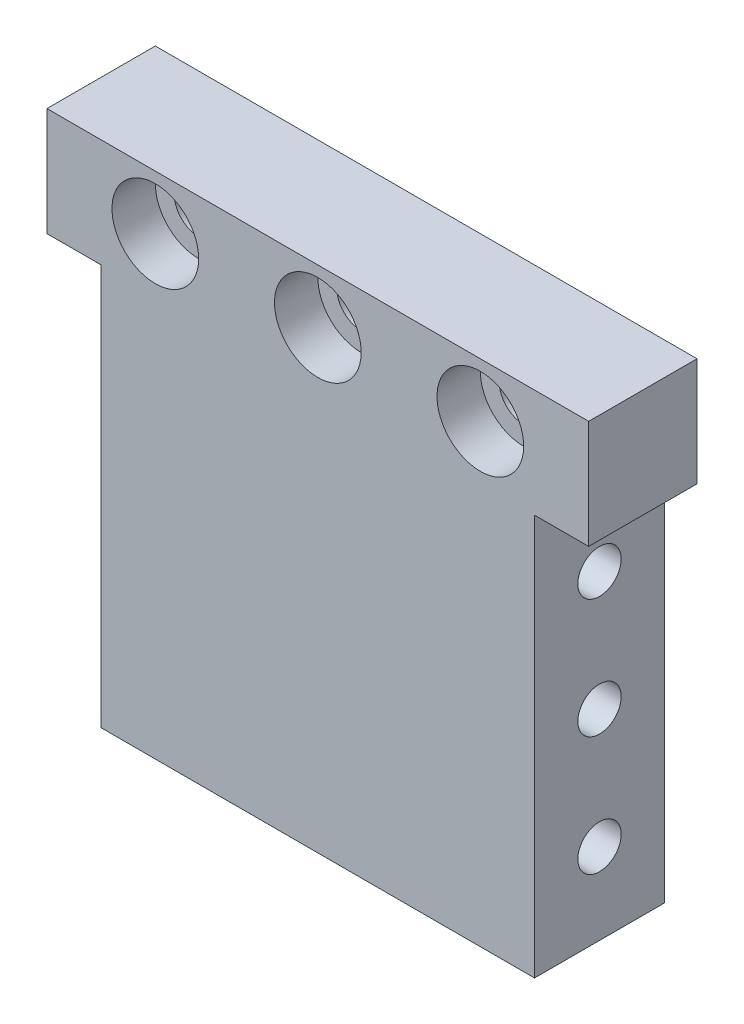
ISO-10303-21;
HEADER;
FILE_DESCRIPTION(('STEP AP214'),'2;1');
FILE_NAME('part.step','',(''),(''),'','','');
FILE_SCHEMA(('AUTOMOTIVE_DESIGN { 1 0 10303 214 1 1 1 1 }'));
ENDSEC;
DATA;
#1=APPLICATION_CONTEXT('core data for automotive mechanical design processes');
#2=APPLICATION_PROTOCOL_DEFINITION('international standard','automotive_design',2000,#1);
#3=PRODUCT_CONTEXT('',#1,'mechanical');
#4=PRODUCT('Part','Part','',(#3));
#5=PRODUCT_RELATED_PRODUCT_CATEGORY('part','',(#4));
#6=PRODUCT_DEFINITION_FORMATION('','',#4);
#7=PRODUCT_DEFINITION_CONTEXT('part definition',#1,'design');
#8=PRODUCT_DEFINITION('design','',#6,#7);
#9=PRODUCT_DEFINITION_SHAPE('','',#8);
#10=(LENGTH_UNIT() NAMED_UNIT(*) SI_UNIT(.MILLI.,.METRE.));
#11=(NAMED_UNIT(*) PLANE_ANGLE_UNIT() SI_UNIT($,.RADIAN.));
#12=(NAMED_UNIT(*) SI_UNIT($,.STERADIAN.) SOLID_ANGLE_UNIT());
#13=UNCERTAINTY_MEASURE_WITH_UNIT(LENGTH_MEASURE(1.E-05),#10,'distance_accuracy_value','');
#14=(GEOMETRIC_REPRESENTATION_CONTEXT(3) GLOBAL_UNCERTAINTY_ASSIGNED_CONTEXT((#13)) GLOBAL_UNIT_ASSIGNED_CONTEXT((#10,
#11,#12)) REPRESENTATION_CONTEXT('',''));
#15=CARTESIAN_POINT('',(0.,0.,0.));
#16=DIRECTION('',(0.,0.,1.));
#17=DIRECTION('',(1.,0.,0.));
#18=AXIS2_PLACEMENT_3D('',#15,#16,#17);
#19=CARTESIAN_POINT('',(40.,42.,0.));
#20=DIRECTION('',(0.,0.,1.));
#21=DIRECTION('',(1.,0.,0.));
#22=AXIS2_PLACEMENT_3D('',#19,#20,#21);
#23=CYLINDRICAL_SURFACE('',#22,2.25);
#24=CARTESIAN_POINT('',(40.,42.,2.));
#25=DIRECTION('',(0.,0.,1.));
#26=DIRECTION('',(1.,0.,0.));
#27=AXIS2_PLACEMENT_3D('',#24,#25,#26);
#28=CIRCLE('',#27,2.25);
#29=CARTESIAN_POINT('',(42.25,42.,2.));
#30=VERTEX_POINT('',#29);
#31=EDGE_CURVE('E136',#30,#30,#28,.T.);
#32=ORIENTED_EDGE('',*,*,#31,.F.);
#33=EDGE_LOOP('',(#32));
#34=FACE_BOUND('',#33,.T.);
#35=CARTESIAN_POINT('',(40.,42.,8.));
#36=DIRECTION('',(0.,0.,1.));
#37=DIRECTION('',(1.,0.,0.));
#38=AXIS2_PLACEMENT_3D('',#35,#36,#37);
#39=CIRCLE('',#38,2.25);
#40=CARTESIAN_POINT('',(42.25,42.,8.));
#41=VERTEX_POINT('',#40);
#42=EDGE_CURVE('E38',#41,#41,#39,.F.);
#43=ORIENTED_EDGE('',*,*,#42,.F.);
#44=EDGE_LOOP('',(#43));
#45=FACE_BOUND('',#44,.T.);
#46=ADVANCED_FACE('F34',(#34,#45),#23,.F.);
#47=CARTESIAN_POINT('',(25.,42.,0.));
#48=DIRECTION('',(0.,0.,1.));
#49=DIRECTION('',(1.,0.,0.));
#50=AXIS2_PLACEMENT_3D('',#47,#48,#49);
#51=CYLINDRICAL_SURFACE('',#50,2.25);
#52=CARTESIAN_POINT('',(25.,42.,2.));
#53=DIRECTION('',(0.,0.,1.));
#54=DIRECTION('',(1.,0.,0.));
#55=AXIS2_PLACEMENT_3D('',#52,#53,#54);
#56=CIRCLE('',#55,2.25);
#57=CARTESIAN_POINT('',(27.25,42.,2.));
#58=VERTEX_POINT('',#57);
#59=EDGE_CURVE('E131',#58,#58,#56,.T.);
#60=ORIENTED_EDGE('',*,*,#59,.F.);
#61=EDGE_LOOP('',(#60));
#62=FACE_BOUND('',#61,.T.);
#63=CARTESIAN_POINT('',(25.,42.,8.));
#64=DIRECTION('',(0.,0.,1.));
#65=DIRECTION('',(1.,0.,0.));
#66=AXIS2_PLACEMENT_3D('',#63,#64,#65);
#67=CIRCLE('',#66,2.25);
#68=CARTESIAN_POINT('',(27.25,42.,8.));
#69=VERTEX_POINT('',#68);
#70=EDGE_CURVE('E164',#69,#69,#67,.F.);
#71=ORIENTED_EDGE('',*,*,#70,.F.);
#72=EDGE_LOOP('',(#71));
#73=FACE_BOUND('',#72,.T.);
#74=ADVANCED_FACE('F285',(#62,#73),#51,.F.);
#75=CARTESIAN_POINT('',(10.,42.,0.));
#76=DIRECTION('',(0.,0.,1.));
#77=DIRECTION('',(1.,0.,0.));
#78=AXIS2_PLACEMENT_3D('',#75,#76,#77);
#79=CYLINDRICAL_SURFACE('',#78,2.25);
#80=CARTESIAN_POINT('',(10.,42.,2.));
#81=DIRECTION('',(0.,0.,1.));
#82=DIRECTION('',(1.,0.,0.));
#83=AXIS2_PLACEMENT_3D('',#80,#81,#82);
#84=CIRCLE('',#83,2.25);
#85=CARTESIAN_POINT('',(12.25,42.,2.));
#86=VERTEX_POINT('',#85);
#87=EDGE_CURVE('E156',#86,#86,#84,.T.);
#88=ORIENTED_EDGE('',*,*,#87,.F.);
#89=EDGE_LOOP('',(#88));
#90=FACE_BOUND('',#89,.T.);
#91=CARTESIAN_POINT('',(10.,42.,8.));
#92=DIRECTION('',(0.,0.,1.));
#93=DIRECTION('',(1.,0.,0.));
#94=AXIS2_PLACEMENT_3D('',#91,#92,#93);
#95=CIRCLE('',#94,2.25);
#96=CARTESIAN_POINT('',(12.25,42.,8.));
#97=VERTEX_POINT('',#96);
#98=EDGE_CURVE('E160',#97,#97,#95,.F.);
#99=ORIENTED_EDGE('',*,*,#98,.F.);
#100=EDGE_LOOP('',(#99));
#101=FACE_BOUND('',#100,.T.);
#102=ADVANCED_FACE('F291',(#90,#101),#79,.F.);
#103=CARTESIAN_POINT('',(0.,0.,12.));
#104=DIRECTION('',(1.,0.,0.));
#105=DIRECTION('',(0.,0.,-1.));
#106=AXIS2_PLACEMENT_3D('',#103,#104,#105);
#107=PLANE('',#106);
#108=DIRECTION('',(0.,1.,0.));
#109=VECTOR('',#108,1.);
#110=CARTESIAN_POINT('',(0.,47.,2.));
#111=LINE('',#110,#109);
#112=CARTESIAN_POINT('',(0.,37.,2.));
#113=VERTEX_POINT('',#112);
#114=CARTESIAN_POINT('',(0.,47.,2.));
#115=VERTEX_POINT('',#114);
#116=EDGE_CURVE('E130',#113,#115,#111,.T.);
#117=ORIENTED_EDGE('',*,*,#116,.F.);
#118=DIRECTION('',(0.,0.,1.));
#119=VECTOR('',#118,1.);
#120=CARTESIAN_POINT('',(0.,37.,0.));
#121=LINE('',#120,#119);
#122=CARTESIAN_POINT('',(0.,37.,12.));
#123=VERTEX_POINT('',#122);
#124=EDGE_CURVE('E159',#113,#123,#121,.T.);
#125=ORIENTED_EDGE('',*,*,#124,.T.);
#126=DIRECTION('',(0.,-1.,0.));
#127=VECTOR('',#126,1.);
#128=CARTESIAN_POINT('',(0.,0.,12.));
#129=LINE('',#128,#127);
#130=CARTESIAN_POINT('',(0.,47.,12.));
#131=VERTEX_POINT('',#130);
#132=EDGE_CURVE('E142',#131,#123,#129,.T.);
#133=ORIENTED_EDGE('',*,*,#132,.F.);
#134=DIRECTION('',(0.,0.,-1.));
#135=VECTOR('',#134,1.);
#136=CARTESIAN_POINT('',(0.,47.,12.));
#137=LINE('',#136,#135);
#138=EDGE_CURVE('E43',#131,#115,#137,.T.);
#139=ORIENTED_EDGE('',*,*,#138,.T.);
#140=EDGE_LOOP('',(#117,#125,#133,#139));
#141=FACE_BOUND('',#140,.T.);
#142=ADVANCED_FACE('F36',(#141),#107,.F.);
#143=CARTESIAN_POINT('',(0.,0.,12.));
#144=DIRECTION('',(0.,1.,0.));
#145=DIRECTION('',(0.,0.,1.));
#146=AXIS2_PLACEMENT_3D('',#143,#144,#145);
#147=PLANE('',#146);
#148=DIRECTION('',(1.,0.,0.));
#149=VECTOR('',#148,1.);
#150=CARTESIAN_POINT('',(0.,0.,0.));
#151=LINE('',#150,#149);
#152=CARTESIAN_POINT('',(5.,0.,0.));
#153=VERTEX_POINT('',#152);
#154=CARTESIAN_POINT('',(45.,0.,0.));
#155=VERTEX_POINT('',#154);
#156=EDGE_CURVE('E145',#153,#155,#151,.T.);
#157=ORIENTED_EDGE('',*,*,#156,.T.);
#158=DIRECTION('',(0.,0.,1.));
#159=VECTOR('',#158,1.);
#160=CARTESIAN_POINT('',(45.,0.,0.));
#161=LINE('',#160,#159);
#162=CARTESIAN_POINT('',(45.,0.,12.));
#163=VERTEX_POINT('',#162);
#164=EDGE_CURVE('E109',#155,#163,#161,.T.);
#165=ORIENTED_EDGE('',*,*,#164,.T.);
#166=DIRECTION('',(1.,0.,0.));
#167=VECTOR('',#166,1.);
#168=CARTESIAN_POINT('',(0.,0.,12.));
#169=LINE('',#168,#167);
#170=CARTESIAN_POINT('',(5.,0.,12.));
#171=VERTEX_POINT('',#170);
#172=EDGE_CURVE('E144',#171,#163,#169,.T.);
#173=ORIENTED_EDGE('',*,*,#172,.F.);
#174=DIRECTION('',(0.,0.,1.));
#175=VECTOR('',#174,1.);
#176=CARTESIAN_POINT('',(5.,0.,0.));
#177=LINE('',#176,#175);
#178=EDGE_CURVE('E228',#153,#171,#177,.T.);
#179=ORIENTED_EDGE('',*,*,#178,.F.);
#180=EDGE_LOOP('',(#157,#165,#173,#179));
#181=FACE_BOUND('',#180,.T.);
#182=ADVANCED_FACE('F261',(#181),#147,.F.);
#183=CARTESIAN_POINT('',(50.,0.,12.));
#184=DIRECTION('',(-1.,0.,0.));
#185=DIRECTION('',(0.,0.,1.));
#186=AXIS2_PLACEMENT_3D('',#183,#184,#185);
#187=PLANE('',#186);
#188=DIRECTION('',(0.,1.,0.));
#189=VECTOR('',#188,1.);
#190=CARTESIAN_POINT('',(50.,0.,12.));
#191=LINE('',#190,#189);
#192=CARTESIAN_POINT('',(50.,37.,12.));
#193=VERTEX_POINT('',#192);
#194=CARTESIAN_POINT('',(50.,47.,12.));
#195=VERTEX_POINT('',#194);
#196=EDGE_CURVE('E148',#193,#195,#191,.T.);
#197=ORIENTED_EDGE('',*,*,#196,.F.);
#198=DIRECTION('',(0.,0.,1.));
#199=VECTOR('',#198,1.);
#200=CARTESIAN_POINT('',(50.,37.,0.));
#201=LINE('',#200,#199);
#202=CARTESIAN_POINT('',(50.,37.,2.));
#203=VERTEX_POINT('',#202);
#204=EDGE_CURVE('E114',#203,#193,#201,.T.);
#205=ORIENTED_EDGE('',*,*,#204,.F.);
#206=DIRECTION('',(0.,-1.,0.));
#207=VECTOR('',#206,1.);
#208=CARTESIAN_POINT('',(50.,47.,2.));
#209=LINE('',#208,#207);
#210=CARTESIAN_POINT('',(50.,47.,2.));
#211=VERTEX_POINT('',#210);
#212=EDGE_CURVE('E239',#211,#203,#209,.T.);
#213=ORIENTED_EDGE('',*,*,#212,.F.);
#214=DIRECTION('',(0.,0.,-1.));
#215=VECTOR('',#214,1.);
#216=CARTESIAN_POINT('',(50.,47.,12.));
#217=LINE('',#216,#215);
#218=EDGE_CURVE('E11',#195,#211,#217,.T.);
#219=ORIENTED_EDGE('',*,*,#218,.F.);
#220=EDGE_LOOP('',(#197,#205,#213,#219));
#221=FACE_BOUND('',#220,.T.);
#222=ADVANCED_FACE('F254',(#221),#187,.F.);
#223=CARTESIAN_POINT('',(0.,47.,12.));
#224=DIRECTION('',(0.,-1.,0.));
#225=DIRECTION('',(0.,0.,-1.));
#226=AXIS2_PLACEMENT_3D('',#223,#224,#225);
#227=PLANE('',#226);
#228=ORIENTED_EDGE('',*,*,#218,.T.);
#229=DIRECTION('',(1.,0.,0.));
#230=VECTOR('',#229,1.);
#231=CARTESIAN_POINT('',(0.,47.,2.));
#232=LINE('',#231,#230);
#233=EDGE_CURVE('E133',#115,#211,#232,.T.);
#234=ORIENTED_EDGE('',*,*,#233,.F.);
#235=ORIENTED_EDGE('',*,*,#138,.F.);
#236=DIRECTION('',(-1.,0.,0.));
#237=VECTOR('',#236,1.);
#238=CARTESIAN_POINT('',(0.,47.,12.));
#239=LINE('',#238,#237);
#240=EDGE_CURVE('E59',#195,#131,#239,.T.);
#241=ORIENTED_EDGE('',*,*,#240,.F.);
#242=EDGE_LOOP('',(#228,#234,#235,#241));
#243=FACE_BOUND('',#242,.T.);
#244=ADVANCED_FACE('F273',(#243),#227,.F.);
#245=CARTESIAN_POINT('',(0.,0.,12.));
#246=DIRECTION('',(0.,0.,-1.));
#247=DIRECTION('',(-1.,0.,0.));
#248=AXIS2_PLACEMENT_3D('',#245,#246,#247);
#249=PLANE('',#248);
#250=CARTESIAN_POINT('',(40.,42.,12.));
#251=DIRECTION('',(0.,0.,1.));
#252=DIRECTION('',(1.,0.,0.));
#253=AXIS2_PLACEMENT_3D('',#250,#251,#252);
#254=CIRCLE('',#253,4.);
#255=CARTESIAN_POINT('',(44.,42.,12.));
#256=VERTEX_POINT('',#255);
#257=EDGE_CURVE('E180',#256,#256,#254,.T.);
#258=ORIENTED_EDGE('',*,*,#257,.F.);
#259=EDGE_LOOP('',(#258));
#260=FACE_BOUND('',#259,.T.);
#261=CARTESIAN_POINT('',(25.,42.,12.));
#262=DIRECTION('',(0.,0.,1.));
#263=DIRECTION('',(1.,0.,0.));
#264=AXIS2_PLACEMENT_3D('',#261,#262,#263);
#265=CIRCLE('',#264,4.);
#266=CARTESIAN_POINT('',(29.,42.,12.));
#267=VERTEX_POINT('',#266);
#268=EDGE_CURVE('E173',#267,#267,#265,.T.);
#269=ORIENTED_EDGE('',*,*,#268,.F.);
#270=EDGE_LOOP('',(#269));
#271=FACE_BOUND('',#270,.T.);
#272=CARTESIAN_POINT('',(10.,42.,12.));
#273=DIRECTION('',(0.,0.,1.));
#274=DIRECTION('',(1.,0.,0.));
#275=AXIS2_PLACEMENT_3D('',#272,#273,#274);
#276=CIRCLE('',#275,4.);
#277=CARTESIAN_POINT('',(14.,42.,12.));
#278=VERTEX_POINT('',#277);
#279=EDGE_CURVE('E166',#278,#278,#276,.T.);
#280=ORIENTED_EDGE('',*,*,#279,.F.);
#281=EDGE_LOOP('',(#280));
#282=FACE_BOUND('',#281,.T.);
#283=ORIENTED_EDGE('',*,*,#172,.T.);
#284=DIRECTION('',(0.,-1.,0.));
#285=VECTOR('',#284,1.);
#286=CARTESIAN_POINT('',(45.,0.,12.));
#287=LINE('',#286,#285);
#288=CARTESIAN_POINT('',(45.,37.,12.));
#289=VERTEX_POINT('',#288);
#290=EDGE_CURVE('E115',#289,#163,#287,.T.);
#291=ORIENTED_EDGE('',*,*,#290,.F.);
#292=DIRECTION('',(-1.,0.,0.));
#293=VECTOR('',#292,1.);
#294=CARTESIAN_POINT('',(50.,37.,12.));
#295=LINE('',#294,#293);
#296=EDGE_CURVE('E218',#193,#289,#295,.T.);
#297=ORIENTED_EDGE('',*,*,#296,.F.);
#298=ORIENTED_EDGE('',*,*,#196,.T.);
#299=ORIENTED_EDGE('',*,*,#240,.T.);
#300=ORIENTED_EDGE('',*,*,#132,.T.);
#301=DIRECTION('',(-1.,0.,0.));
#302=VECTOR('',#301,1.);
#303=CARTESIAN_POINT('',(0.,37.,12.));
#304=LINE('',#303,#302);
#305=CARTESIAN_POINT('',(5.,37.,12.));
#306=VERTEX_POINT('',#305);
#307=EDGE_CURVE('E229',#306,#123,#304,.T.);
#308=ORIENTED_EDGE('',*,*,#307,.F.);
#309=DIRECTION('',(0.,1.,0.));
#310=VECTOR('',#309,1.);
#311=CARTESIAN_POINT('',(5.,0.,12.));
#312=LINE('',#311,#310);
#313=EDGE_CURVE('E224',#171,#306,#312,.T.);
#314=ORIENTED_EDGE('',*,*,#313,.F.);
#315=EDGE_LOOP('',(#283,#291,#297,#298,#299,#300,#308,#314));
#316=FACE_BOUND('',#315,.T.);
#317=ADVANCED_FACE('F256',(#260,#271,#282,#316),#249,.F.);
#318=CARTESIAN_POINT('',(0.,0.,0.));
#319=DIRECTION('',(0.,0.,-1.));
#320=DIRECTION('',(-1.,0.,0.));
#321=AXIS2_PLACEMENT_3D('',#318,#319,#320);
#322=PLANE('',#321);
#323=DIRECTION('',(0.,-1.,0.));
#324=VECTOR('',#323,1.);
#325=CARTESIAN_POINT('',(45.,0.,0.));
#326=LINE('',#325,#324);
#327=CARTESIAN_POINT('',(45.,37.,0.));
#328=VERTEX_POINT('',#327);
#329=EDGE_CURVE('E106',#328,#155,#326,.T.);
#330=ORIENTED_EDGE('',*,*,#329,.T.);
#331=ORIENTED_EDGE('',*,*,#156,.F.);
#332=DIRECTION('',(0.,1.,0.));
#333=VECTOR('',#332,1.);
#334=CARTESIAN_POINT('',(5.,0.,0.));
#335=LINE('',#334,#333);
#336=CARTESIAN_POINT('',(5.,37.,0.));
#337=VERTEX_POINT('',#336);
#338=EDGE_CURVE('E129',#153,#337,#335,.T.);
#339=ORIENTED_EDGE('',*,*,#338,.T.);
#340=DIRECTION('',(-1.,0.,0.));
#341=VECTOR('',#340,1.);
#342=CARTESIAN_POINT('',(0.,37.,0.));
#343=LINE('',#342,#341);
#344=EDGE_CURVE('E121',#328,#337,#343,.T.);
#345=ORIENTED_EDGE('',*,*,#344,.F.);
#346=EDGE_LOOP('',(#330,#331,#339,#345));
#347=FACE_BOUND('',#346,.T.);
#348=ADVANCED_FACE('F128',(#347),#322,.T.);
#349=CARTESIAN_POINT('',(0.,37.,2.));
#350=DIRECTION('',(0.,-1.,0.));
#351=DIRECTION('',(1.,0.,0.));
#352=AXIS2_PLACEMENT_3D('',#349,#350,#351);
#353=PLANE('',#352);
#354=DIRECTION('',(-1.,0.,0.));
#355=VECTOR('',#354,1.);
#356=CARTESIAN_POINT('',(0.,37.,2.));
#357=LINE('',#356,#355);
#358=CARTESIAN_POINT('',(45.,37.,2.));
#359=VERTEX_POINT('',#358);
#360=CARTESIAN_POINT('',(5.,37.,2.));
#361=VERTEX_POINT('',#360);
#362=EDGE_CURVE('E123',#359,#361,#357,.T.);
#363=ORIENTED_EDGE('',*,*,#362,.F.);
#364=DIRECTION('',(0.,0.,1.));
#365=VECTOR('',#364,1.);
#366=CARTESIAN_POINT('',(45.,37.,0.));
#367=LINE('',#366,#365);
#368=EDGE_CURVE('E51',#328,#359,#367,.T.);
#369=ORIENTED_EDGE('',*,*,#368,.F.);
#370=ORIENTED_EDGE('',*,*,#344,.T.);
#371=DIRECTION('',(0.,0.,1.));
#372=VECTOR('',#371,1.);
#373=CARTESIAN_POINT('',(5.,37.,0.));
#374=LINE('',#373,#372);
#375=EDGE_CURVE('E235',#337,#361,#374,.T.);
#376=ORIENTED_EDGE('',*,*,#375,.T.);
#377=EDGE_LOOP('',(#363,#369,#370,#376));
#378=FACE_BOUND('',#377,.T.);
#379=ADVANCED_FACE('F119',(#378),#353,.F.);
#380=CARTESIAN_POINT('',(0.,0.,2.));
#381=DIRECTION('',(0.,0.,1.));
#382=DIRECTION('',(1.,0.,0.));
#383=AXIS2_PLACEMENT_3D('',#380,#381,#382);
#384=PLANE('',#383);
#385=ORIENTED_EDGE('',*,*,#87,.T.);
#386=EDGE_LOOP('',(#385));
#387=FACE_BOUND('',#386,.T.);
#388=ORIENTED_EDGE('',*,*,#31,.T.);
#389=EDGE_LOOP('',(#388));
#390=FACE_BOUND('',#389,.T.);
#391=ORIENTED_EDGE('',*,*,#59,.T.);
#392=EDGE_LOOP('',(#391));
#393=FACE_BOUND('',#392,.T.);
#394=ORIENTED_EDGE('',*,*,#116,.T.);
#395=ORIENTED_EDGE('',*,*,#233,.T.);
#396=ORIENTED_EDGE('',*,*,#212,.T.);
#397=EDGE_CURVE('E140',#203,#359,#357,.T.);
#398=ORIENTED_EDGE('',*,*,#397,.T.);
#399=ORIENTED_EDGE('',*,*,#362,.T.);
#400=EDGE_CURVE('E241',#361,#113,#357,.T.);
#401=ORIENTED_EDGE('',*,*,#400,.T.);
#402=EDGE_LOOP('',(#394,#395,#396,#398,#399,#401));
#403=FACE_BOUND('',#402,.T.);
#404=ADVANCED_FACE('F247',(#387,#390,#393,#403),#384,.F.);
#405=CARTESIAN_POINT('',(0.,37.,0.));
#406=DIRECTION('',(0.,1.,0.));
#407=DIRECTION('',(0.,0.,1.));
#408=AXIS2_PLACEMENT_3D('',#405,#406,#407);
#409=PLANE('',#408);
#410=EDGE_CURVE('E237',#361,#306,#374,.T.);
#411=ORIENTED_EDGE('',*,*,#410,.T.);
#412=ORIENTED_EDGE('',*,*,#307,.T.);
#413=ORIENTED_EDGE('',*,*,#124,.F.);
#414=ORIENTED_EDGE('',*,*,#400,.F.);
#415=EDGE_LOOP('',(#411,#412,#413,#414));
#416=FACE_BOUND('',#415,.T.);
#417=ADVANCED_FACE('F269',(#416),#409,.F.);
#418=CARTESIAN_POINT('',(5.,0.,0.));
#419=DIRECTION('',(1.,0.,0.));
#420=DIRECTION('',(0.,0.,-1.));
#421=AXIS2_PLACEMENT_3D('',#418,#419,#420);
#422=PLANE('',#421);
#423=CARTESIAN_POINT('',(5.,7.5,6.));
#424=DIRECTION('',(-1.,0.,0.));
#425=DIRECTION('',(0.,0.,1.));
#426=AXIS2_PLACEMENT_3D('',#423,#424,#425);
#427=CIRCLE('',#426,2.);
#428=CARTESIAN_POINT('',(5.,7.5,8.));
#429=VERTEX_POINT('',#428);
#430=EDGE_CURVE('E162',#429,#429,#427,.T.);
#431=ORIENTED_EDGE('',*,*,#430,.F.);
#432=EDGE_LOOP('',(#431));
#433=FACE_BOUND('',#432,.T.);
#434=CARTESIAN_POINT('',(5.,18.5,6.));
#435=DIRECTION('',(-1.,0.,0.));
#436=DIRECTION('',(0.,0.,1.));
#437=AXIS2_PLACEMENT_3D('',#434,#435,#436);
#438=CIRCLE('',#437,2.);
#439=CARTESIAN_POINT('',(5.,18.5,8.));
#440=VERTEX_POINT('',#439);
#441=EDGE_CURVE('E188',#440,#440,#438,.T.);
#442=ORIENTED_EDGE('',*,*,#441,.F.);
#443=EDGE_LOOP('',(#442));
#444=FACE_BOUND('',#443,.T.);
#445=CARTESIAN_POINT('',(5.,29.5,6.));
#446=DIRECTION('',(-1.,0.,0.));
#447=DIRECTION('',(0.,0.,1.));
#448=AXIS2_PLACEMENT_3D('',#445,#446,#447);
#449=CIRCLE('',#448,2.);
#450=CARTESIAN_POINT('',(5.,29.5,8.));
#451=VERTEX_POINT('',#450);
#452=EDGE_CURVE('E194',#451,#451,#449,.T.);
#453=ORIENTED_EDGE('',*,*,#452,.F.);
#454=EDGE_LOOP('',(#453));
#455=FACE_BOUND('',#454,.T.);
#456=ORIENTED_EDGE('',*,*,#313,.T.);
#457=ORIENTED_EDGE('',*,*,#410,.F.);
#458=ORIENTED_EDGE('',*,*,#375,.F.);
#459=ORIENTED_EDGE('',*,*,#338,.F.);
#460=ORIENTED_EDGE('',*,*,#178,.T.);
#461=EDGE_LOOP('',(#456,#457,#458,#459,#460));
#462=FACE_BOUND('',#461,.T.);
#463=ADVANCED_FACE('F264',(#433,#444,#455,#462),#422,.F.);
#464=CARTESIAN_POINT('',(50.,37.,0.));
#465=DIRECTION('',(0.,1.,0.));
#466=DIRECTION('',(0.,0.,1.));
#467=AXIS2_PLACEMENT_3D('',#464,#465,#466);
#468=PLANE('',#467);
#469=ORIENTED_EDGE('',*,*,#204,.T.);
#470=ORIENTED_EDGE('',*,*,#296,.T.);
#471=EDGE_CURVE('E125',#359,#289,#367,.T.);
#472=ORIENTED_EDGE('',*,*,#471,.F.);
#473=ORIENTED_EDGE('',*,*,#397,.F.);
#474=EDGE_LOOP('',(#469,#470,#472,#473));
#475=FACE_BOUND('',#474,.T.);
#476=ADVANCED_FACE('F250',(#475),#468,.F.);
#477=CARTESIAN_POINT('',(45.,0.,0.));
#478=DIRECTION('',(-1.,0.,0.));
#479=DIRECTION('',(0.,0.,1.));
#480=AXIS2_PLACEMENT_3D('',#477,#478,#479);
#481=PLANE('',#480);
#482=CARTESIAN_POINT('',(45.,7.49999999999999,6.));
#483=DIRECTION('',(1.,0.,0.));
#484=DIRECTION('',(0.,0.,-1.));
#485=AXIS2_PLACEMENT_3D('',#482,#483,#484);
#486=CIRCLE('',#485,2.);
#487=CARTESIAN_POINT('',(45.,7.49999999999999,4.));
#488=VERTEX_POINT('',#487);
#489=EDGE_CURVE('E200',#488,#488,#486,.T.);
#490=ORIENTED_EDGE('',*,*,#489,.F.);
#491=EDGE_LOOP('',(#490));
#492=FACE_BOUND('',#491,.T.);
#493=CARTESIAN_POINT('',(45.,18.5,6.));
#494=DIRECTION('',(1.,0.,0.));
#495=DIRECTION('',(0.,0.,-1.));
#496=AXIS2_PLACEMENT_3D('',#493,#494,#495);
#497=CIRCLE('',#496,2.);
#498=CARTESIAN_POINT('',(45.,18.5,4.));
#499=VERTEX_POINT('',#498);
#500=EDGE_CURVE('E206',#499,#499,#497,.T.);
#501=ORIENTED_EDGE('',*,*,#500,.F.);
#502=EDGE_LOOP('',(#501));
#503=FACE_BOUND('',#502,.T.);
#504=CARTESIAN_POINT('',(45.,29.5,6.));
#505=DIRECTION('',(1.,0.,0.));
#506=DIRECTION('',(0.,0.,-1.));
#507=AXIS2_PLACEMENT_3D('',#504,#505,#506);
#508=CIRCLE('',#507,2.);
#509=CARTESIAN_POINT('',(45.,29.5,4.));
#510=VERTEX_POINT('',#509);
#511=EDGE_CURVE('E212',#510,#510,#508,.T.);
#512=ORIENTED_EDGE('',*,*,#511,.F.);
#513=EDGE_LOOP('',(#512));
#514=FACE_BOUND('',#513,.T.);
#515=ORIENTED_EDGE('',*,*,#290,.T.);
#516=ORIENTED_EDGE('',*,*,#164,.F.);
#517=ORIENTED_EDGE('',*,*,#329,.F.);
#518=ORIENTED_EDGE('',*,*,#368,.T.);
#519=ORIENTED_EDGE('',*,*,#471,.T.);
#520=EDGE_LOOP('',(#515,#516,#517,#518,#519));
#521=FACE_BOUND('',#520,.T.);
#522=ADVANCED_FACE('F107',(#492,#503,#514,#521),#481,.F.);
#523=CARTESIAN_POINT('',(35.,29.5,6.));
#524=DIRECTION('',(1.,0.,0.));
#525=DIRECTION('',(0.,0.,-1.));
#526=AXIS2_PLACEMENT_3D('',#523,#524,#525);
#527=CYLINDRICAL_SURFACE('',#526,2.);
#528=CARTESIAN_POINT('',(35.,29.5,6.));
#529=DIRECTION('',(1.,0.,0.));
#530=DIRECTION('',(0.,0.,-1.));
#531=AXIS2_PLACEMENT_3D('',#528,#529,#530);
#532=CIRCLE('',#531,2.);
#533=CARTESIAN_POINT('',(35.,29.5,4.));
#534=VERTEX_POINT('',#533);
#535=EDGE_CURVE('E215',#534,#534,#532,.T.);
#536=ORIENTED_EDGE('',*,*,#535,.F.);
#537=EDGE_LOOP('',(#536));
#538=FACE_BOUND('',#537,.T.);
#539=ORIENTED_EDGE('',*,*,#511,.T.);
#540=EDGE_LOOP('',(#539));
#541=FACE_BOUND('',#540,.T.);
#542=ADVANCED_FACE('F343',(#538,#541),#527,.F.);
#543=CARTESIAN_POINT('',(35.,29.5,6.));
#544=DIRECTION('',(1.,0.,0.));
#545=DIRECTION('',(0.,0.,-1.));
#546=AXIS2_PLACEMENT_3D('',#543,#544,#545);
#547=PLANE('',#546);
#548=ORIENTED_EDGE('',*,*,#535,.T.);
#549=EDGE_LOOP('',(#548));
#550=FACE_BOUND('',#549,.T.);
#551=ADVANCED_FACE('F351',(#550),#547,.T.);
#552=CARTESIAN_POINT('',(35.,18.5,6.));
#553=DIRECTION('',(1.,0.,0.));
#554=DIRECTION('',(0.,0.,-1.));
#555=AXIS2_PLACEMENT_3D('',#552,#553,#554);
#556=CYLINDRICAL_SURFACE('',#555,2.);
#557=CARTESIAN_POINT('',(35.,18.5,6.));
#558=DIRECTION('',(1.,0.,0.));
#559=DIRECTION('',(0.,0.,-1.));
#560=AXIS2_PLACEMENT_3D('',#557,#558,#559);
#561=CIRCLE('',#560,2.);
#562=CARTESIAN_POINT('',(35.,18.5,4.));
#563=VERTEX_POINT('',#562);
#564=EDGE_CURVE('E209',#563,#563,#561,.T.);
#565=ORIENTED_EDGE('',*,*,#564,.F.);
#566=EDGE_LOOP('',(#565));
#567=FACE_BOUND('',#566,.T.);
#568=ORIENTED_EDGE('',*,*,#500,.T.);
#569=EDGE_LOOP('',(#568));
#570=FACE_BOUND('',#569,.T.);
#571=ADVANCED_FACE('F359',(#567,#570),#556,.F.);
#572=CARTESIAN_POINT('',(35.,18.5,6.));
#573=DIRECTION('',(1.,0.,0.));
#574=DIRECTION('',(0.,0.,-1.));
#575=AXIS2_PLACEMENT_3D('',#572,#573,#574);
#576=PLANE('',#575);
#577=ORIENTED_EDGE('',*,*,#564,.T.);
#578=EDGE_LOOP('',(#577));
#579=FACE_BOUND('',#578,.T.);
#580=ADVANCED_FACE('F367',(#579),#576,.T.);
#581=CARTESIAN_POINT('',(35.,7.49999999999999,6.));
#582=DIRECTION('',(1.,0.,0.));
#583=DIRECTION('',(0.,0.,-1.));
#584=AXIS2_PLACEMENT_3D('',#581,#582,#583);
#585=CYLINDRICAL_SURFACE('',#584,2.);
#586=CARTESIAN_POINT('',(35.,7.49999999999999,6.));
#587=DIRECTION('',(1.,0.,0.));
#588=DIRECTION('',(0.,0.,-1.));
#589=AXIS2_PLACEMENT_3D('',#586,#587,#588);
#590=CIRCLE('',#589,2.);
#591=CARTESIAN_POINT('',(35.,7.49999999999999,4.));
#592=VERTEX_POINT('',#591);
#593=EDGE_CURVE('E203',#592,#592,#590,.T.);
#594=ORIENTED_EDGE('',*,*,#593,.F.);
#595=EDGE_LOOP('',(#594));
#596=FACE_BOUND('',#595,.T.);
#597=ORIENTED_EDGE('',*,*,#489,.T.);
#598=EDGE_LOOP('',(#597));
#599=FACE_BOUND('',#598,.T.);
#600=ADVANCED_FACE('F375',(#596,#599),#585,.F.);
#601=CARTESIAN_POINT('',(35.,7.49999999999999,6.));
#602=DIRECTION('',(1.,0.,0.));
#603=DIRECTION('',(0.,0.,-1.));
#604=AXIS2_PLACEMENT_3D('',#601,#602,#603);
#605=PLANE('',#604);
#606=ORIENTED_EDGE('',*,*,#593,.T.);
#607=EDGE_LOOP('',(#606));
#608=FACE_BOUND('',#607,.T.);
#609=ADVANCED_FACE('F383',(#608),#605,.T.);
#610=CARTESIAN_POINT('',(15.,29.5,6.));
#611=DIRECTION('',(-1.,0.,0.));
#612=DIRECTION('',(0.,0.,1.));
#613=AXIS2_PLACEMENT_3D('',#610,#611,#612);
#614=CYLINDRICAL_SURFACE('',#613,2.);
#615=CARTESIAN_POINT('',(15.,29.5,6.));
#616=DIRECTION('',(-1.,0.,0.));
#617=DIRECTION('',(0.,0.,1.));
#618=AXIS2_PLACEMENT_3D('',#615,#616,#617);
#619=CIRCLE('',#618,2.);
#620=CARTESIAN_POINT('',(15.,29.5,8.));
#621=VERTEX_POINT('',#620);
#622=EDGE_CURVE('E197',#621,#621,#619,.T.);
#623=ORIENTED_EDGE('',*,*,#622,.F.);
#624=EDGE_LOOP('',(#623));
#625=FACE_BOUND('',#624,.T.);
#626=ORIENTED_EDGE('',*,*,#452,.T.);
#627=EDGE_LOOP('',(#626));
#628=FACE_BOUND('',#627,.T.);
#629=ADVANCED_FACE('F390',(#625,#628),#614,.F.);
#630=CARTESIAN_POINT('',(15.,29.5,6.));
#631=DIRECTION('',(-1.,0.,0.));
#632=DIRECTION('',(0.,0.,1.));
#633=AXIS2_PLACEMENT_3D('',#630,#631,#632);
#634=PLANE('',#633);
#635=ORIENTED_EDGE('',*,*,#622,.T.);
#636=EDGE_LOOP('',(#635));
#637=FACE_BOUND('',#636,.T.);
#638=ADVANCED_FACE('F397',(#637),#634,.T.);
#639=CARTESIAN_POINT('',(15.,18.5,6.));
#640=DIRECTION('',(-1.,0.,0.));
#641=DIRECTION('',(0.,0.,1.));
#642=AXIS2_PLACEMENT_3D('',#639,#640,#641);
#643=CYLINDRICAL_SURFACE('',#642,2.);
#644=CARTESIAN_POINT('',(15.,18.5,6.));
#645=DIRECTION('',(-1.,0.,0.));
#646=DIRECTION('',(0.,0.,1.));
#647=AXIS2_PLACEMENT_3D('',#644,#645,#646);
#648=CIRCLE('',#647,2.);
#649=CARTESIAN_POINT('',(15.,18.5,8.));
#650=VERTEX_POINT('',#649);
#651=EDGE_CURVE('E191',#650,#650,#648,.T.);
#652=ORIENTED_EDGE('',*,*,#651,.F.);
#653=EDGE_LOOP('',(#652));
#654=FACE_BOUND('',#653,.T.);
#655=ORIENTED_EDGE('',*,*,#441,.T.);
#656=EDGE_LOOP('',(#655));
#657=FACE_BOUND('',#656,.T.);
#658=ADVANCED_FACE('F405',(#654,#657),#643,.F.);
#659=CARTESIAN_POINT('',(15.,18.5,6.));
#660=DIRECTION('',(-1.,0.,0.));
#661=DIRECTION('',(0.,0.,1.));
#662=AXIS2_PLACEMENT_3D('',#659,#660,#661);
#663=PLANE('',#662);
#664=ORIENTED_EDGE('',*,*,#651,.T.);
#665=EDGE_LOOP('',(#664));
#666=FACE_BOUND('',#665,.T.);
#667=ADVANCED_FACE('F413',(#666),#663,.T.);
#668=CARTESIAN_POINT('',(15.,7.5,6.));
#669=DIRECTION('',(-1.,0.,0.));
#670=DIRECTION('',(0.,0.,1.));
#671=AXIS2_PLACEMENT_3D('',#668,#669,#670);
#672=CYLINDRICAL_SURFACE('',#671,2.);
#673=CARTESIAN_POINT('',(15.,7.5,6.));
#674=DIRECTION('',(-1.,0.,0.));
#675=DIRECTION('',(0.,0.,1.));
#676=AXIS2_PLACEMENT_3D('',#673,#674,#675);
#677=CIRCLE('',#676,2.);
#678=CARTESIAN_POINT('',(15.,7.5,8.));
#679=VERTEX_POINT('',#678);
#680=EDGE_CURVE('E185',#679,#679,#677,.T.);
#681=ORIENTED_EDGE('',*,*,#680,.F.);
#682=EDGE_LOOP('',(#681));
#683=FACE_BOUND('',#682,.T.);
#684=ORIENTED_EDGE('',*,*,#430,.T.);
#685=EDGE_LOOP('',(#684));
#686=FACE_BOUND('',#685,.T.);
#687=ADVANCED_FACE('F421',(#683,#686),#672,.F.);
#688=CARTESIAN_POINT('',(15.,7.5,6.));
#689=DIRECTION('',(-1.,0.,0.));
#690=DIRECTION('',(0.,0.,1.));
#691=AXIS2_PLACEMENT_3D('',#688,#689,#690);
#692=PLANE('',#691);
#693=ORIENTED_EDGE('',*,*,#680,.T.);
#694=EDGE_LOOP('',(#693));
#695=FACE_BOUND('',#694,.T.);
#696=ADVANCED_FACE('F429',(#695),#692,.T.);
#697=CARTESIAN_POINT('',(10.,42.,8.));
#698=DIRECTION('',(0.,0.,1.));
#699=DIRECTION('',(1.,0.,0.));
#700=AXIS2_PLACEMENT_3D('',#697,#698,#699);
#701=PLANE('',#700);
#702=CARTESIAN_POINT('',(10.,42.,8.));
#703=DIRECTION('',(0.,0.,1.));
#704=DIRECTION('',(1.,0.,0.));
#705=AXIS2_PLACEMENT_3D('',#702,#703,#704);
#706=CIRCLE('',#705,4.);
#707=CARTESIAN_POINT('',(14.,42.,8.));
#708=VERTEX_POINT('',#707);
#709=EDGE_CURVE('E163',#708,#708,#706,.T.);
#710=ORIENTED_EDGE('',*,*,#709,.T.);
#711=EDGE_LOOP('',(#710));
#712=FACE_BOUND('',#711,.T.);
#713=ORIENTED_EDGE('',*,*,#98,.T.);
#714=EDGE_LOOP('',(#713));
#715=FACE_BOUND('',#714,.T.);
#716=ADVANCED_FACE('F437',(#712,#715),#701,.T.);
#717=CARTESIAN_POINT('',(10.,42.,8.));
#718=DIRECTION('',(0.,0.,1.));
#719=DIRECTION('',(1.,0.,0.));
#720=AXIS2_PLACEMENT_3D('',#717,#718,#719);
#721=CYLINDRICAL_SURFACE('',#720,4.);
#722=ORIENTED_EDGE('',*,*,#709,.F.);
#723=EDGE_LOOP('',(#722));
#724=FACE_BOUND('',#723,.T.);
#725=ORIENTED_EDGE('',*,*,#279,.T.);
#726=EDGE_LOOP('',(#725));
#727=FACE_BOUND('',#726,.T.);
#728=ADVANCED_FACE('F445',(#724,#727),#721,.F.);
#729=CARTESIAN_POINT('',(25.,42.,8.));
#730=DIRECTION('',(0.,0.,1.));
#731=DIRECTION('',(1.,0.,0.));
#732=AXIS2_PLACEMENT_3D('',#729,#730,#731);
#733=PLANE('',#732);
#734=CARTESIAN_POINT('',(25.,42.,8.));
#735=DIRECTION('',(0.,0.,1.));
#736=DIRECTION('',(1.,0.,0.));
#737=AXIS2_PLACEMENT_3D('',#734,#735,#736);
#738=CIRCLE('',#737,4.);
#739=CARTESIAN_POINT('',(29.,42.,8.));
#740=VERTEX_POINT('',#739);
#741=EDGE_CURVE('E167',#740,#740,#738,.T.);
#742=ORIENTED_EDGE('',*,*,#741,.T.);
#743=EDGE_LOOP('',(#742));
#744=FACE_BOUND('',#743,.T.);
#745=ORIENTED_EDGE('',*,*,#70,.T.);
#746=EDGE_LOOP('',(#745));
#747=FACE_BOUND('',#746,.T.);
#748=ADVANCED_FACE('F453',(#744,#747),#733,.T.);
#749=CARTESIAN_POINT('',(25.,42.,8.));
#750=DIRECTION('',(0.,0.,1.));
#751=DIRECTION('',(1.,0.,0.));
#752=AXIS2_PLACEMENT_3D('',#749,#750,#751);
#753=CYLINDRICAL_SURFACE('',#752,4.);
#754=ORIENTED_EDGE('',*,*,#741,.F.);
#755=EDGE_LOOP('',(#754));
#756=FACE_BOUND('',#755,.T.);
#757=ORIENTED_EDGE('',*,*,#268,.T.);
#758=EDGE_LOOP('',(#757));
#759=FACE_BOUND('',#758,.T.);
#760=ADVANCED_FACE('F461',(#756,#759),#753,.F.);
#761=CARTESIAN_POINT('',(40.,42.,8.));
#762=DIRECTION('',(0.,0.,1.));
#763=DIRECTION('',(1.,0.,0.));
#764=AXIS2_PLACEMENT_3D('',#761,#762,#763);
#765=PLANE('',#764);
#766=CARTESIAN_POINT('',(40.,42.,8.));
#767=DIRECTION('',(0.,0.,1.));
#768=DIRECTION('',(1.,0.,0.));
#769=AXIS2_PLACEMENT_3D('',#766,#767,#768);
#770=CIRCLE('',#769,4.);
#771=CARTESIAN_POINT('',(44.,42.,8.));
#772=VERTEX_POINT('',#771);
#773=EDGE_CURVE('E593',#772,#772,#770,.T.);
#774=ORIENTED_EDGE('',*,*,#773,.T.);
#775=EDGE_LOOP('',(#774));
#776=FACE_BOUND('',#775,.T.);
#777=ORIENTED_EDGE('',*,*,#42,.T.);
#778=EDGE_LOOP('',(#777));
#779=FACE_BOUND('',#778,.T.);
#780=ADVANCED_FACE('F468',(#776,#779),#765,.T.);
#781=CARTESIAN_POINT('',(40.,42.,8.));
#782=DIRECTION('',(0.,0.,1.));
#783=DIRECTION('',(1.,0.,0.));
#784=AXIS2_PLACEMENT_3D('',#781,#782,#783);
#785=CYLINDRICAL_SURFACE('',#784,4.);
#786=ORIENTED_EDGE('',*,*,#773,.F.);
#787=EDGE_LOOP('',(#786));
#788=FACE_BOUND('',#787,.T.);
#789=ORIENTED_EDGE('',*,*,#257,.T.);
#790=EDGE_LOOP('',(#789));
#791=FACE_BOUND('',#790,.T.);
#792=ADVANCED_FACE('F476',(#788,#791),#785,.F.);
#793=CLOSED_SHELL('',(#46,#74,#102,#142,#182,#222,#244,#317,#348,#379,#404,#417,#463,#476,#522,
#542,#551,#571,#580,#600,#609,#629,#638,#658,#667,#687,#696,#716,#728,#748,#760,#780,#792));
#794=MANIFOLD_SOLID_BREP('B2',#793);
#795=ADVANCED_BREP_SHAPE_REPRESENTATION('',(#18,#794),#14);
#796=SHAPE_DEFINITION_REPRESENTATION(#9,#795);
ENDSEC;
END-ISO-10303-21;
